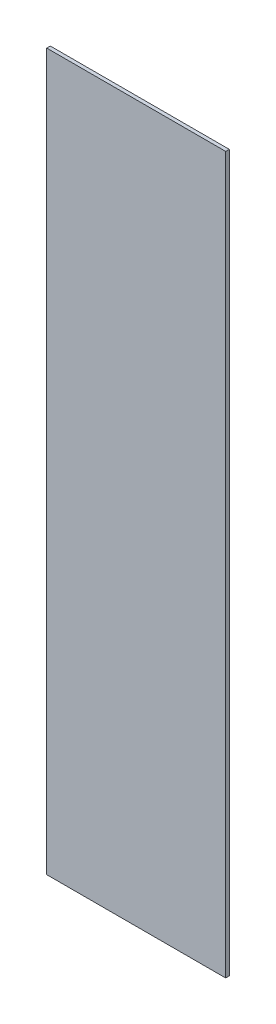
ISO-10303-21;
HEADER;
FILE_DESCRIPTION(('STEP AP214'),'2;1');
FILE_NAME('part.step','',(''),(''),'','','');
FILE_SCHEMA(('AUTOMOTIVE_DESIGN { 1 0 10303 214 1 1 1 1 }'));
ENDSEC;
DATA;
#1=APPLICATION_CONTEXT('core data for automotive mechanical design processes');
#2=APPLICATION_PROTOCOL_DEFINITION('international standard','automotive_design',2000,#1);
#3=PRODUCT_CONTEXT('',#1,'mechanical');
#4=PRODUCT('Part','Part','',(#3));
#5=PRODUCT_RELATED_PRODUCT_CATEGORY('part','',(#4));
#6=PRODUCT_DEFINITION_FORMATION('','',#4);
#7=PRODUCT_DEFINITION_CONTEXT('part definition',#1,'design');
#8=PRODUCT_DEFINITION('design','',#6,#7);
#9=PRODUCT_DEFINITION_SHAPE('','',#8);
#10=(LENGTH_UNIT() NAMED_UNIT(*) SI_UNIT(.MILLI.,.METRE.));
#11=(NAMED_UNIT(*) PLANE_ANGLE_UNIT() SI_UNIT($,.RADIAN.));
#12=(NAMED_UNIT(*) SI_UNIT($,.STERADIAN.) SOLID_ANGLE_UNIT());
#13=UNCERTAINTY_MEASURE_WITH_UNIT(LENGTH_MEASURE(1.E-05),#10,'distance_accuracy_value','');
#14=(GEOMETRIC_REPRESENTATION_CONTEXT(3) GLOBAL_UNCERTAINTY_ASSIGNED_CONTEXT((#13)) GLOBAL_UNIT_ASSIGNED_CONTEXT((#10,
#11,#12)) REPRESENTATION_CONTEXT('',''));
#15=CARTESIAN_POINT('',(0.,0.,0.));
#16=DIRECTION('',(0.,0.,1.));
#17=DIRECTION('',(1.,0.,0.));
#18=AXIS2_PLACEMENT_3D('',#15,#16,#17);
#19=CARTESIAN_POINT('',(635.,-2540.,25.4));
#20=DIRECTION('',(-1.,0.,0.));
#21=DIRECTION('',(0.,0.,1.));
#22=AXIS2_PLACEMENT_3D('',#19,#20,#21);
#23=PLANE('',#22);
#24=DIRECTION('',(0.,1.,0.));
#25=VECTOR('',#24,1.);
#26=CARTESIAN_POINT('',(635.,-2540.,0.));
#27=LINE('',#26,#25);
#28=CARTESIAN_POINT('',(635.,-2540.,0.));
#29=VERTEX_POINT('',#28);
#30=CARTESIAN_POINT('',(635.,2540.,0.));
#31=VERTEX_POINT('',#30);
#32=EDGE_CURVE('E100',#29,#31,#27,.T.);
#33=ORIENTED_EDGE('',*,*,#32,.T.);
#34=DIRECTION('',(0.,0.,-1.));
#35=VECTOR('',#34,1.);
#36=CARTESIAN_POINT('',(635.,2540.,25.4));
#37=LINE('',#36,#35);
#38=CARTESIAN_POINT('',(635.,2540.,25.4));
#39=VERTEX_POINT('',#38);
#40=EDGE_CURVE('E11',#39,#31,#37,.T.);
#41=ORIENTED_EDGE('',*,*,#40,.F.);
#42=DIRECTION('',(0.,1.,0.));
#43=VECTOR('',#42,1.);
#44=CARTESIAN_POINT('',(635.,-2540.,25.4));
#45=LINE('',#44,#43);
#46=CARTESIAN_POINT('',(635.,-2540.,25.4));
#47=VERTEX_POINT('',#46);
#48=EDGE_CURVE('E88',#47,#39,#45,.T.);
#49=ORIENTED_EDGE('',*,*,#48,.F.);
#50=DIRECTION('',(0.,0.,-1.));
#51=VECTOR('',#50,1.);
#52=CARTESIAN_POINT('',(635.,-2540.,25.4));
#53=LINE('',#52,#51);
#54=EDGE_CURVE('E96',#47,#29,#53,.T.);
#55=ORIENTED_EDGE('',*,*,#54,.T.);
#56=EDGE_LOOP('',(#33,#41,#49,#55));
#57=FACE_BOUND('',#56,.T.);
#58=ADVANCED_FACE('F37',(#57),#23,.F.);
#59=CARTESIAN_POINT('',(-635.,2540.,25.4));
#60=DIRECTION('',(0.,-1.,0.));
#61=DIRECTION('',(0.,0.,-1.));
#62=AXIS2_PLACEMENT_3D('',#59,#60,#61);
#63=PLANE('',#62);
#64=DIRECTION('',(-1.,0.,0.));
#65=VECTOR('',#64,1.);
#66=CARTESIAN_POINT('',(-635.,2540.,0.));
#67=LINE('',#66,#65);
#68=CARTESIAN_POINT('',(-635.,2540.,0.));
#69=VERTEX_POINT('',#68);
#70=EDGE_CURVE('E92',#31,#69,#67,.T.);
#71=ORIENTED_EDGE('',*,*,#70,.T.);
#72=DIRECTION('',(0.,0.,-1.));
#73=VECTOR('',#72,1.);
#74=CARTESIAN_POINT('',(-635.,2540.,25.4));
#75=LINE('',#74,#73);
#76=CARTESIAN_POINT('',(-635.,2540.,25.4));
#77=VERTEX_POINT('',#76);
#78=EDGE_CURVE('E45',#77,#69,#75,.T.);
#79=ORIENTED_EDGE('',*,*,#78,.F.);
#80=DIRECTION('',(-1.,0.,0.));
#81=VECTOR('',#80,1.);
#82=CARTESIAN_POINT('',(-635.,2540.,25.4));
#83=LINE('',#82,#81);
#84=EDGE_CURVE('E83',#39,#77,#83,.T.);
#85=ORIENTED_EDGE('',*,*,#84,.F.);
#86=ORIENTED_EDGE('',*,*,#40,.T.);
#87=EDGE_LOOP('',(#71,#79,#85,#86));
#88=FACE_BOUND('',#87,.T.);
#89=ADVANCED_FACE('F91',(#88),#63,.F.);
#90=CARTESIAN_POINT('',(-635.,-2540.,25.4));
#91=DIRECTION('',(1.,0.,0.));
#92=DIRECTION('',(0.,0.,-1.));
#93=AXIS2_PLACEMENT_3D('',#90,#91,#92);
#94=PLANE('',#93);
#95=DIRECTION('',(0.,-1.,0.));
#96=VECTOR('',#95,1.);
#97=CARTESIAN_POINT('',(-635.,-2540.,0.));
#98=LINE('',#97,#96);
#99=CARTESIAN_POINT('',(-635.,-2540.,0.));
#100=VERTEX_POINT('',#99);
#101=EDGE_CURVE('E70',#69,#100,#98,.T.);
#102=ORIENTED_EDGE('',*,*,#101,.T.);
#103=DIRECTION('',(0.,0.,-1.));
#104=VECTOR('',#103,1.);
#105=CARTESIAN_POINT('',(-635.,-2540.,25.4));
#106=LINE('',#105,#104);
#107=CARTESIAN_POINT('',(-635.,-2540.,25.4));
#108=VERTEX_POINT('',#107);
#109=EDGE_CURVE('E93',#108,#100,#106,.T.);
#110=ORIENTED_EDGE('',*,*,#109,.F.);
#111=DIRECTION('',(0.,-1.,0.));
#112=VECTOR('',#111,1.);
#113=CARTESIAN_POINT('',(-635.,-2540.,25.4));
#114=LINE('',#113,#112);
#115=EDGE_CURVE('E86',#77,#108,#114,.T.);
#116=ORIENTED_EDGE('',*,*,#115,.F.);
#117=ORIENTED_EDGE('',*,*,#78,.T.);
#118=EDGE_LOOP('',(#102,#110,#116,#117));
#119=FACE_BOUND('',#118,.T.);
#120=ADVANCED_FACE('F94',(#119),#94,.F.);
#121=CARTESIAN_POINT('',(-635.,-2540.,25.4));
#122=DIRECTION('',(0.,1.,0.));
#123=DIRECTION('',(0.,0.,1.));
#124=AXIS2_PLACEMENT_3D('',#121,#122,#123);
#125=PLANE('',#124);
#126=DIRECTION('',(1.,0.,0.));
#127=VECTOR('',#126,1.);
#128=CARTESIAN_POINT('',(-635.,-2540.,0.));
#129=LINE('',#128,#127);
#130=EDGE_CURVE('E76',#100,#29,#129,.T.);
#131=ORIENTED_EDGE('',*,*,#130,.T.);
#132=ORIENTED_EDGE('',*,*,#54,.F.);
#133=DIRECTION('',(1.,0.,0.));
#134=VECTOR('',#133,1.);
#135=CARTESIAN_POINT('',(-635.,-2540.,25.4));
#136=LINE('',#135,#134);
#137=EDGE_CURVE('E53',#108,#47,#136,.T.);
#138=ORIENTED_EDGE('',*,*,#137,.F.);
#139=ORIENTED_EDGE('',*,*,#109,.T.);
#140=EDGE_LOOP('',(#131,#132,#138,#139));
#141=FACE_BOUND('',#140,.T.);
#142=ADVANCED_FACE('F107',(#141),#125,.F.);
#143=CARTESIAN_POINT('',(0.,0.,25.4));
#144=DIRECTION('',(0.,0.,-1.));
#145=DIRECTION('',(-1.,0.,0.));
#146=AXIS2_PLACEMENT_3D('',#143,#144,#145);
#147=PLANE('',#146);
#148=ORIENTED_EDGE('',*,*,#48,.T.);
#149=ORIENTED_EDGE('',*,*,#84,.T.);
#150=ORIENTED_EDGE('',*,*,#115,.T.);
#151=ORIENTED_EDGE('',*,*,#137,.T.);
#152=EDGE_LOOP('',(#148,#149,#150,#151));
#153=FACE_BOUND('',#152,.T.);
#154=ADVANCED_FACE('F84',(#153),#147,.F.);
#155=CARTESIAN_POINT('',(0.,0.,0.));
#156=DIRECTION('',(0.,0.,-1.));
#157=DIRECTION('',(-1.,0.,0.));
#158=AXIS2_PLACEMENT_3D('',#155,#156,#157);
#159=PLANE('',#158);
#160=ORIENTED_EDGE('',*,*,#32,.F.);
#161=ORIENTED_EDGE('',*,*,#130,.F.);
#162=ORIENTED_EDGE('',*,*,#101,.F.);
#163=ORIENTED_EDGE('',*,*,#70,.F.);
#164=EDGE_LOOP('',(#160,#161,#162,#163));
#165=FACE_BOUND('',#164,.T.);
#166=ADVANCED_FACE('F110',(#165),#159,.T.);
#167=CLOSED_SHELL('',(#58,#89,#120,#142,#154,#166));
#168=MANIFOLD_SOLID_BREP('B2',#167);
#169=ADVANCED_BREP_SHAPE_REPRESENTATION('',(#18,#168),#14);
#170=SHAPE_DEFINITION_REPRESENTATION(#9,#169);
ENDSEC;
END-ISO-10303-21;
